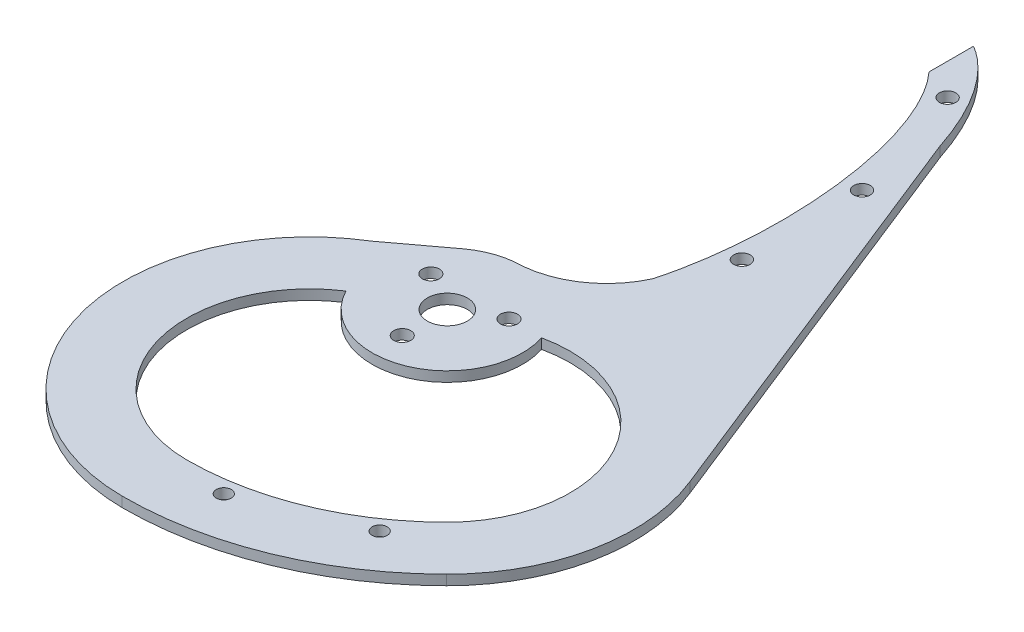
ISO-10303-21;
HEADER;
FILE_DESCRIPTION(('STEP AP214'),'2;1');
FILE_NAME('part.step','',(''),(''),'','','');
FILE_SCHEMA(('AUTOMOTIVE_DESIGN { 1 0 10303 214 1 1 1 1 }'));
ENDSEC;
DATA;
#1=APPLICATION_CONTEXT('core data for automotive mechanical design processes');
#2=APPLICATION_PROTOCOL_DEFINITION('international standard','automotive_design',2000,#1);
#3=PRODUCT_CONTEXT('',#1,'mechanical');
#4=PRODUCT('Part','Part','',(#3));
#5=PRODUCT_RELATED_PRODUCT_CATEGORY('part','',(#4));
#6=PRODUCT_DEFINITION_FORMATION('','',#4);
#7=PRODUCT_DEFINITION_CONTEXT('part definition',#1,'design');
#8=PRODUCT_DEFINITION('design','',#6,#7);
#9=PRODUCT_DEFINITION_SHAPE('','',#8);
#10=(LENGTH_UNIT() NAMED_UNIT(*) SI_UNIT(.MILLI.,.METRE.));
#11=(NAMED_UNIT(*) PLANE_ANGLE_UNIT() SI_UNIT($,.RADIAN.));
#12=(NAMED_UNIT(*) SI_UNIT($,.STERADIAN.) SOLID_ANGLE_UNIT());
#13=UNCERTAINTY_MEASURE_WITH_UNIT(LENGTH_MEASURE(1.E-05),#10,'distance_accuracy_value','');
#14=(GEOMETRIC_REPRESENTATION_CONTEXT(3) GLOBAL_UNCERTAINTY_ASSIGNED_CONTEXT((#13)) GLOBAL_UNIT_ASSIGNED_CONTEXT((#10,
#11,#12)) REPRESENTATION_CONTEXT('',''));
#15=CARTESIAN_POINT('',(0.,0.,0.));
#16=DIRECTION('',(0.,0.,1.));
#17=DIRECTION('',(1.,0.,0.));
#18=AXIS2_PLACEMENT_3D('',#15,#16,#17);
#19=CARTESIAN_POINT('',(0.,2.,-50.));
#20=DIRECTION('',(0.,1.,0.));
#21=DIRECTION('',(0.,0.,1.));
#22=AXIS2_PLACEMENT_3D('',#19,#20,#21);
#23=PLANE('',#22);
#24=CARTESIAN_POINT('',(13.298587158446,2.,-86.5375679284794));
#25=DIRECTION('',(0.,-1.,0.));
#26=DIRECTION('',(0.,0.,-1.));
#27=AXIS2_PLACEMENT_3D('',#24,#25,#26);
#28=CIRCLE('',#27,1.65);
#29=CARTESIAN_POINT('',(13.298587158446,2.,-88.1875679284794));
#30=VERTEX_POINT('',#29);
#31=EDGE_CURVE('E536',#30,#30,#28,.T.);
#32=ORIENTED_EDGE('',*,*,#31,.T.);
#33=EDGE_LOOP('',(#32));
#34=FACE_BOUND('',#33,.T.);
#35=CARTESIAN_POINT('',(20.7726012422299,2.,-61.9930669189694));
#36=DIRECTION('',(0.,-1.,0.));
#37=DIRECTION('',(0.,0.,-1.));
#38=AXIS2_PLACEMENT_3D('',#35,#36,#37);
#39=CIRCLE('',#38,1.64999999999971);
#40=CARTESIAN_POINT('',(20.7726012422299,2.,-63.6430669189691));
#41=VERTEX_POINT('',#40);
#42=EDGE_CURVE('E540',#41,#41,#39,.T.);
#43=ORIENTED_EDGE('',*,*,#42,.T.);
#44=EDGE_LOOP('',(#43));
#45=FACE_BOUND('',#44,.T.);
#46=CARTESIAN_POINT('',(20.7726012422298,2.,-38.0069330810301));
#47=DIRECTION('',(0.,-1.,0.));
#48=DIRECTION('',(0.,0.,-1.));
#49=AXIS2_PLACEMENT_3D('',#46,#47,#48);
#50=CIRCLE('',#49,1.65000000000007);
#51=CARTESIAN_POINT('',(20.7726012422298,2.,-39.6569330810302));
#52=VERTEX_POINT('',#51);
#53=EDGE_CURVE('E550',#52,#52,#50,.T.);
#54=ORIENTED_EDGE('',*,*,#53,.T.);
#55=EDGE_LOOP('',(#54));
#56=FACE_BOUND('',#55,.T.);
#57=CARTESIAN_POINT('',(-7.79422863405993,2.,-4.50000000000003));
#58=DIRECTION('',(0.,1.,0.));
#59=DIRECTION('',(0.,0.,1.));
#60=AXIS2_PLACEMENT_3D('',#57,#58,#59);
#61=CIRCLE('',#60,1.7);
#62=CARTESIAN_POINT('',(-7.79422863405993,2.,-2.80000000000003));
#63=VERTEX_POINT('',#62);
#64=EDGE_CURVE('E562',#63,#63,#61,.T.);
#65=ORIENTED_EDGE('',*,*,#64,.F.);
#66=EDGE_LOOP('',(#65));
#67=FACE_BOUND('',#66,.T.);
#68=CARTESIAN_POINT('',(0.,2.,0.));
#69=DIRECTION('',(0.,1.,0.));
#70=DIRECTION('',(0.,0.,1.));
#71=AXIS2_PLACEMENT_3D('',#68,#69,#70);
#72=CIRCLE('',#71,4.);
#73=CARTESIAN_POINT('',(0.,2.,4.));
#74=VERTEX_POINT('',#73);
#75=EDGE_CURVE('E167',#74,#74,#72,.T.);
#76=ORIENTED_EDGE('',*,*,#75,.F.);
#77=EDGE_LOOP('',(#76));
#78=FACE_BOUND('',#77,.T.);
#79=CARTESIAN_POINT('',(9.55064977168081,2.,54.1644264156715));
#80=DIRECTION('',(0.,1.,0.));
#81=DIRECTION('',(0.,0.,1.));
#82=AXIS2_PLACEMENT_3D('',#79,#80,#81);
#83=CIRCLE('',#82,1.5);
#84=CARTESIAN_POINT('',(9.55064977168081,2.,55.6644264156715));
#85=VERTEX_POINT('',#84);
#86=EDGE_CURVE('E183',#85,#85,#83,.T.);
#87=ORIENTED_EDGE('',*,*,#86,.F.);
#88=EDGE_LOOP('',(#87));
#89=FACE_BOUND('',#88,.T.);
#90=CARTESIAN_POINT('',(0.,2.,27.5));
#91=DIRECTION('',(0.,1.,0.));
#92=DIRECTION('',(0.,0.,1.));
#93=AXIS2_PLACEMENT_3D('',#90,#91,#92);
#94=CIRCLE('',#93,37.2013155746489);
#95=CARTESIAN_POINT('',(-19.3568297431625,2.,-4.26871138052086));
#96=VERTEX_POINT('',#95);
#97=CARTESIAN_POINT('',(-0.216613018645578,2.,64.7006849303177));
#98=VERTEX_POINT('',#97);
#99=EDGE_CURVE('E189',#96,#98,#94,.T.);
#100=ORIENTED_EDGE('',*,*,#99,.T.);
#101=CARTESIAN_POINT('',(0.,2.,0.));
#102=DIRECTION('',(0.,1.,0.));
#103=DIRECTION('',(0.,0.,-1.));
#104=AXIS2_PLACEMENT_3D('',#101,#102,#103);
#105=CIRCLE('',#104,64.7010475313351);
#106=CARTESIAN_POINT('',(45.6623974442698,2.,45.8385319495905));
#107=VERTEX_POINT('',#106);
#108=EDGE_CURVE('E192',#98,#107,#105,.T.);
#109=ORIENTED_EDGE('',*,*,#108,.T.);
#110=CARTESIAN_POINT('',(19.4454364826301,2.,19.44543648263));
#111=DIRECTION('',(0.,1.,0.));
#112=DIRECTION('',(0.,0.,1.));
#113=AXIS2_PLACEMENT_3D('',#110,#111,#112);
#114=CIRCLE('',#113,37.2011361438361);
#115=CARTESIAN_POINT('',(53.9585739590909,2.,5.56134947904393));
#116=VERTEX_POINT('',#115);
#117=EDGE_CURVE('E195',#107,#116,#114,.T.);
#118=ORIENTED_EDGE('',*,*,#117,.T.);
#119=DIRECTION('',(-0.370096027626198,0.,-0.928993503925247));
#120=VECTOR('',#119,1.);
#121=CARTESIAN_POINT('',(53.9585739590909,2.,5.56134947904394));
#122=LINE('',#121,#120);
#123=CARTESIAN_POINT('',(20.9296157641286,2.,-77.3460186473965));
#124=VERTEX_POINT('',#123);
#125=EDGE_CURVE('E197',#116,#124,#122,.T.);
#126=ORIENTED_EDGE('',*,*,#125,.T.);
#127=CARTESIAN_POINT('',(0.,2.,-50.));
#128=DIRECTION('',(0.,1.,0.));
#129=DIRECTION('',(0.,0.,-1.));
#130=AXIS2_PLACEMENT_3D('',#127,#128,#129);
#131=ELLIPSE('',#130,50.,25.);
#132=CARTESIAN_POINT('',(6.99999999999997,2.,-98.));
#133=VERTEX_POINT('',#132);
#134=EDGE_CURVE('E199',#124,#133,#131,.T.);
#135=ORIENTED_EDGE('',*,*,#134,.T.);
#136=DIRECTION('',(0.,0.,1.));
#137=VECTOR('',#136,1.);
#138=CARTESIAN_POINT('',(6.99999999999997,2.,-98.));
#139=LINE('',#138,#137);
#140=CARTESIAN_POINT('',(6.99999999999999,2.,-89.1252365482393));
#141=VERTEX_POINT('',#140);
#142=EDGE_CURVE('E202',#133,#141,#139,.T.);
#143=ORIENTED_EDGE('',*,*,#142,.T.);
#144=CARTESIAN_POINT('',(0.,2.,-50.));
#145=DIRECTION('',(0.,-1.,0.));
#146=DIRECTION('',(-0.0150123976327859,0.,-0.99988730760887));
#147=AXIS2_PLACEMENT_3D('',#144,#145,#146);
#148=ELLIPSE('',#147,43.022823817247,18.0020286916584);
#149=CARTESIAN_POINT('',(15.1926129793547,2.,-25.8295121690699));
#150=VERTEX_POINT('',#149);
#151=EDGE_CURVE('E255',#141,#150,#148,.T.);
#152=ORIENTED_EDGE('',*,*,#151,.T.);
#153=CARTESIAN_POINT('',(-1.78232615932989,2.,-33.5719448745214));
#154=DIRECTION('',(0.,-1.,0.));
#155=DIRECTION('',(0.,0.,1.));
#156=AXIS2_PLACEMENT_3D('',#153,#154,#155);
#157=CIRCLE('',#156,18.6572726560045);
#158=CARTESIAN_POINT('',(0.,2.,-15.));
#159=VERTEX_POINT('',#158);
#160=EDGE_CURVE('E258',#150,#159,#157,.T.);
#161=ORIENTED_EDGE('',*,*,#160,.T.);
#162=CARTESIAN_POINT('',(0.,2.,0.));
#163=DIRECTION('',(0.,1.,0.));
#164=DIRECTION('',(0.,0.,1.));
#165=AXIS2_PLACEMENT_3D('',#162,#163,#164);
#166=CIRCLE('',#165,15.);
#167=CARTESIAN_POINT('',(-8.97302418013445,2.,-12.0201845685797));
#168=VERTEX_POINT('',#167);
#169=EDGE_CURVE('E260',#159,#168,#166,.T.);
#170=ORIENTED_EDGE('',*,*,#169,.T.);
#171=DIRECTION('',(-0.801345637905316,0.,0.598201612008963));
#172=VECTOR('',#171,1.);
#173=CARTESIAN_POINT('',(-19.3568297431625,2.,-4.26871138052086));
#174=LINE('',#173,#172);
#175=EDGE_CURVE('E262',#168,#96,#174,.T.);
#176=ORIENTED_EDGE('',*,*,#175,.T.);
#177=EDGE_LOOP('',(#100,#109,#118,#126,#135,#143,#152,#161,#170,#176));
#178=FACE_BOUND('',#177,.T.);
#179=CARTESIAN_POINT('',(31.5467039993079,2.,45.0533624358943));
#180=DIRECTION('',(0.,1.,0.));
#181=DIRECTION('',(0.,0.,-1.));
#182=AXIS2_PLACEMENT_3D('',#179,#180,#181);
#183=CIRCLE('',#182,1.5);
#184=CARTESIAN_POINT('',(31.5467039993079,2.,43.5533624358943));
#185=VERTEX_POINT('',#184);
#186=EDGE_CURVE('E177',#185,#185,#183,.T.);
#187=ORIENTED_EDGE('',*,*,#186,.F.);
#188=EDGE_LOOP('',(#187));
#189=FACE_BOUND('',#188,.T.);
#190=CARTESIAN_POINT('',(0.,2.,0.));
#191=DIRECTION('',(0.,1.,0.));
#192=DIRECTION('',(0.,0.,1.));
#193=AXIS2_PLACEMENT_3D('',#190,#191,#192);
#194=CIRCLE('',#193,52.);
#195=CARTESIAN_POINT('',(0.,2.,52.));
#196=VERTEX_POINT('',#195);
#197=CARTESIAN_POINT('',(36.7695526217005,2.,36.7695526217005));
#198=VERTEX_POINT('',#197);
#199=EDGE_CURVE('E146',#196,#198,#194,.T.);
#200=ORIENTED_EDGE('',*,*,#199,.F.);
#201=CARTESIAN_POINT('',(0.,2.,27.5));
#202=DIRECTION('',(0.,1.,0.));
#203=DIRECTION('',(0.,0.,-1.));
#204=AXIS2_PLACEMENT_3D('',#201,#202,#203);
#205=CIRCLE('',#204,24.5);
#206=CARTESIAN_POINT('',(-13.3046192189774,2.,6.9272727272727));
#207=VERTEX_POINT('',#206);
#208=EDGE_CURVE('E138',#207,#196,#205,.T.);
#209=ORIENTED_EDGE('',*,*,#208,.F.);
#210=CARTESIAN_POINT('',(0.,2.,0.));
#211=DIRECTION('',(0.,-1.,0.));
#212=DIRECTION('',(0.,0.,1.));
#213=AXIS2_PLACEMENT_3D('',#210,#211,#212);
#214=CIRCLE('',#213,15.);
#215=CARTESIAN_POINT('',(14.306107991427,2.,-4.50946495026066));
#216=VERTEX_POINT('',#215);
#217=EDGE_CURVE('E161',#216,#207,#214,.T.);
#218=ORIENTED_EDGE('',*,*,#217,.F.);
#219=CARTESIAN_POINT('',(19.4454364826301,2.,19.44543648263));
#220=DIRECTION('',(0.,1.,0.));
#221=DIRECTION('',(0.,0.,1.));
#222=AXIS2_PLACEMENT_3D('',#219,#220,#221);
#223=CIRCLE('',#222,24.5);
#224=EDGE_CURVE('E159',#198,#216,#223,.T.);
#225=ORIENTED_EDGE('',*,*,#224,.F.);
#226=EDGE_LOOP('',(#200,#209,#218,#225));
#227=FACE_BOUND('',#226,.T.);
#228=CARTESIAN_POINT('',(0.,2.,9.));
#229=DIRECTION('',(0.,1.,0.));
#230=DIRECTION('',(0.,0.,1.));
#231=AXIS2_PLACEMENT_3D('',#228,#229,#230);
#232=CIRCLE('',#231,1.7);
#233=CARTESIAN_POINT('',(0.,2.,10.7));
#234=VERTEX_POINT('',#233);
#235=EDGE_CURVE('E568',#234,#234,#232,.T.);
#236=ORIENTED_EDGE('',*,*,#235,.F.);
#237=EDGE_LOOP('',(#236));
#238=FACE_BOUND('',#237,.T.);
#239=CARTESIAN_POINT('',(7.79422863405999,2.,-4.49999999999993));
#240=DIRECTION('',(0.,1.,0.));
#241=DIRECTION('',(0.,0.,1.));
#242=AXIS2_PLACEMENT_3D('',#239,#240,#241);
#243=CIRCLE('',#242,1.7);
#244=CARTESIAN_POINT('',(7.79422863405999,2.,-2.79999999999993));
#245=VERTEX_POINT('',#244);
#246=EDGE_CURVE('E556',#245,#245,#243,.T.);
#247=ORIENTED_EDGE('',*,*,#246,.F.);
#248=EDGE_LOOP('',(#247));
#249=FACE_BOUND('',#248,.T.);
#250=ADVANCED_FACE('F37',(#34,#45,#56,#67,#78,#89,#178,#189,#227,#238,#249),#23,.T.);
#251=CARTESIAN_POINT('',(0.,0.,-50.));
#252=DIRECTION('',(0.,1.,0.));
#253=DIRECTION('',(0.,0.,1.));
#254=AXIS2_PLACEMENT_3D('',#251,#252,#253);
#255=PLANE('',#254);
#256=CARTESIAN_POINT('',(13.298587158446,0.,-86.5375679284794));
#257=DIRECTION('',(0.,-1.,0.));
#258=DIRECTION('',(0.,0.,-1.));
#259=AXIS2_PLACEMENT_3D('',#256,#257,#258);
#260=CIRCLE('',#259,1.65);
#261=CARTESIAN_POINT('',(13.298587158446,0.,-88.1875679284794));
#262=VERTEX_POINT('',#261);
#263=EDGE_CURVE('E539',#262,#262,#260,.T.);
#264=ORIENTED_EDGE('',*,*,#263,.F.);
#265=EDGE_LOOP('',(#264));
#266=FACE_BOUND('',#265,.T.);
#267=CARTESIAN_POINT('',(20.7726012422299,0.,-61.9930669189694));
#268=DIRECTION('',(0.,-1.,0.));
#269=DIRECTION('',(0.,0.,-1.));
#270=AXIS2_PLACEMENT_3D('',#267,#268,#269);
#271=CIRCLE('',#270,1.64999999999971);
#272=CARTESIAN_POINT('',(20.7726012422299,0.,-63.6430669189691));
#273=VERTEX_POINT('',#272);
#274=EDGE_CURVE('E545',#273,#273,#271,.T.);
#275=ORIENTED_EDGE('',*,*,#274,.F.);
#276=EDGE_LOOP('',(#275));
#277=FACE_BOUND('',#276,.T.);
#278=CARTESIAN_POINT('',(20.7726012422298,0.,-38.0069330810301));
#279=DIRECTION('',(0.,-1.,0.));
#280=DIRECTION('',(0.,0.,-1.));
#281=AXIS2_PLACEMENT_3D('',#278,#279,#280);
#282=CIRCLE('',#281,1.65000000000007);
#283=CARTESIAN_POINT('',(20.7726012422298,0.,-39.6569330810302));
#284=VERTEX_POINT('',#283);
#285=EDGE_CURVE('E542',#284,#284,#282,.T.);
#286=ORIENTED_EDGE('',*,*,#285,.F.);
#287=EDGE_LOOP('',(#286));
#288=FACE_BOUND('',#287,.T.);
#289=CARTESIAN_POINT('',(31.5467039993079,0.,45.0533624358943));
#290=DIRECTION('',(0.,1.,0.));
#291=DIRECTION('',(0.,0.,-1.));
#292=AXIS2_PLACEMENT_3D('',#289,#290,#291);
#293=CIRCLE('',#292,1.5);
#294=CARTESIAN_POINT('',(31.5467039993079,0.,43.5533624358943));
#295=VERTEX_POINT('',#294);
#296=EDGE_CURVE('E154',#295,#295,#293,.T.);
#297=ORIENTED_EDGE('',*,*,#296,.T.);
#298=EDGE_LOOP('',(#297));
#299=FACE_BOUND('',#298,.T.);
#300=CARTESIAN_POINT('',(9.55064977168081,0.,54.1644264156715));
#301=DIRECTION('',(0.,1.,0.));
#302=DIRECTION('',(0.,0.,1.));
#303=AXIS2_PLACEMENT_3D('',#300,#301,#302);
#304=CIRCLE('',#303,1.5);
#305=CARTESIAN_POINT('',(9.55064977168081,0.,55.6644264156715));
#306=VERTEX_POINT('',#305);
#307=EDGE_CURVE('E180',#306,#306,#304,.T.);
#308=ORIENTED_EDGE('',*,*,#307,.T.);
#309=EDGE_LOOP('',(#308));
#310=FACE_BOUND('',#309,.T.);
#311=CARTESIAN_POINT('',(0.,0.,27.5));
#312=DIRECTION('',(0.,1.,0.));
#313=DIRECTION('',(0.,0.,1.));
#314=AXIS2_PLACEMENT_3D('',#311,#312,#313);
#315=CIRCLE('',#314,37.2013155746489);
#316=CARTESIAN_POINT('',(-19.3568297431625,0.,-4.26871138052086));
#317=VERTEX_POINT('',#316);
#318=CARTESIAN_POINT('',(-0.216613018645578,0.,64.7006849303177));
#319=VERTEX_POINT('',#318);
#320=EDGE_CURVE('E186',#317,#319,#315,.T.);
#321=ORIENTED_EDGE('',*,*,#320,.F.);
#322=DIRECTION('',(-0.801345637905316,0.,0.598201612008963));
#323=VECTOR('',#322,1.);
#324=CARTESIAN_POINT('',(-19.3568297431625,0.,-4.26871138052086));
#325=LINE('',#324,#323);
#326=CARTESIAN_POINT('',(-8.97302418013445,0.,-12.0201845685797));
#327=VERTEX_POINT('',#326);
#328=EDGE_CURVE('E193',#327,#317,#325,.T.);
#329=ORIENTED_EDGE('',*,*,#328,.F.);
#330=CARTESIAN_POINT('',(0.,0.,0.));
#331=DIRECTION('',(0.,1.,0.));
#332=DIRECTION('',(0.,0.,1.));
#333=AXIS2_PLACEMENT_3D('',#330,#331,#332);
#334=CIRCLE('',#333,15.);
#335=CARTESIAN_POINT('',(0.,0.,-15.));
#336=VERTEX_POINT('',#335);
#337=EDGE_CURVE('E281',#336,#327,#334,.T.);
#338=ORIENTED_EDGE('',*,*,#337,.F.);
#339=CARTESIAN_POINT('',(-1.78232615932989,0.,-33.5719448745214));
#340=DIRECTION('',(0.,-1.,0.));
#341=DIRECTION('',(0.,0.,1.));
#342=AXIS2_PLACEMENT_3D('',#339,#340,#341);
#343=CIRCLE('',#342,18.6572726560045);
#344=CARTESIAN_POINT('',(15.1926129793547,0.,-25.8295121690699));
#345=VERTEX_POINT('',#344);
#346=EDGE_CURVE('E279',#345,#336,#343,.T.);
#347=ORIENTED_EDGE('',*,*,#346,.F.);
#348=CARTESIAN_POINT('',(0.,0.,-50.));
#349=DIRECTION('',(0.,-1.,0.));
#350=DIRECTION('',(-0.0150123976327859,0.,-0.99988730760887));
#351=AXIS2_PLACEMENT_3D('',#348,#349,#350);
#352=ELLIPSE('',#351,43.022823817247,18.0020286916584);
#353=CARTESIAN_POINT('',(6.99999999999999,0.,-89.1252365482393));
#354=VERTEX_POINT('',#353);
#355=EDGE_CURVE('E277',#354,#345,#352,.T.);
#356=ORIENTED_EDGE('',*,*,#355,.F.);
#357=DIRECTION('',(0.,0.,1.));
#358=VECTOR('',#357,1.);
#359=CARTESIAN_POINT('',(6.99999999999997,0.,-98.));
#360=LINE('',#359,#358);
#361=CARTESIAN_POINT('',(6.99999999999997,0.,-98.));
#362=VERTEX_POINT('',#361);
#363=EDGE_CURVE('E275',#362,#354,#360,.T.);
#364=ORIENTED_EDGE('',*,*,#363,.F.);
#365=CARTESIAN_POINT('',(0.,0.,-50.));
#366=DIRECTION('',(0.,1.,0.));
#367=DIRECTION('',(0.,0.,-1.));
#368=AXIS2_PLACEMENT_3D('',#365,#366,#367);
#369=ELLIPSE('',#368,50.,25.);
#370=CARTESIAN_POINT('',(20.9296157641286,0.,-77.3460186473965));
#371=VERTEX_POINT('',#370);
#372=EDGE_CURVE('E273',#371,#362,#369,.T.);
#373=ORIENTED_EDGE('',*,*,#372,.F.);
#374=DIRECTION('',(-0.370096027626198,0.,-0.928993503925247));
#375=VECTOR('',#374,1.);
#376=CARTESIAN_POINT('',(53.9585739590909,0.,5.56134947904394));
#377=LINE('',#376,#375);
#378=CARTESIAN_POINT('',(53.9585739590909,0.,5.56134947904393));
#379=VERTEX_POINT('',#378);
#380=EDGE_CURVE('E271',#379,#371,#377,.T.);
#381=ORIENTED_EDGE('',*,*,#380,.F.);
#382=CARTESIAN_POINT('',(19.4454364826301,0.,19.44543648263));
#383=DIRECTION('',(0.,1.,0.));
#384=DIRECTION('',(0.,0.,1.));
#385=AXIS2_PLACEMENT_3D('',#382,#383,#384);
#386=CIRCLE('',#385,37.2011361438361);
#387=CARTESIAN_POINT('',(45.6623974442698,0.,45.8385319495905));
#388=VERTEX_POINT('',#387);
#389=EDGE_CURVE('E269',#388,#379,#386,.T.);
#390=ORIENTED_EDGE('',*,*,#389,.F.);
#391=CARTESIAN_POINT('',(0.,0.,0.));
#392=DIRECTION('',(0.,1.,0.));
#393=DIRECTION('',(0.,0.,-1.));
#394=AXIS2_PLACEMENT_3D('',#391,#392,#393);
#395=CIRCLE('',#394,64.7010475313351);
#396=EDGE_CURVE('E267',#319,#388,#395,.T.);
#397=ORIENTED_EDGE('',*,*,#396,.F.);
#398=EDGE_LOOP('',(#321,#329,#338,#347,#356,#364,#373,#381,#390,#397));
#399=FACE_BOUND('',#398,.T.);
#400=CARTESIAN_POINT('',(0.,0.,27.5));
#401=DIRECTION('',(0.,1.,0.));
#402=DIRECTION('',(0.,0.,-1.));
#403=AXIS2_PLACEMENT_3D('',#400,#401,#402);
#404=CIRCLE('',#403,24.5);
#405=CARTESIAN_POINT('',(-13.3046192189774,0.,6.9272727272727));
#406=VERTEX_POINT('',#405);
#407=CARTESIAN_POINT('',(0.,0.,52.));
#408=VERTEX_POINT('',#407);
#409=EDGE_CURVE('E60',#406,#408,#404,.T.);
#410=ORIENTED_EDGE('',*,*,#409,.T.);
#411=CARTESIAN_POINT('',(0.,0.,0.));
#412=DIRECTION('',(0.,1.,0.));
#413=DIRECTION('',(0.,0.,1.));
#414=AXIS2_PLACEMENT_3D('',#411,#412,#413);
#415=CIRCLE('',#414,52.);
#416=CARTESIAN_POINT('',(36.7695526217005,0.,36.7695526217005));
#417=VERTEX_POINT('',#416);
#418=EDGE_CURVE('E153',#408,#417,#415,.T.);
#419=ORIENTED_EDGE('',*,*,#418,.T.);
#420=CARTESIAN_POINT('',(19.4454364826301,0.,19.44543648263));
#421=DIRECTION('',(0.,1.,0.));
#422=DIRECTION('',(0.,0.,1.));
#423=AXIS2_PLACEMENT_3D('',#420,#421,#422);
#424=CIRCLE('',#423,24.5);
#425=CARTESIAN_POINT('',(14.306107991427,0.,-4.50946495026066));
#426=VERTEX_POINT('',#425);
#427=EDGE_CURVE('E169',#417,#426,#424,.T.);
#428=ORIENTED_EDGE('',*,*,#427,.T.);
#429=CARTESIAN_POINT('',(0.,0.,0.));
#430=DIRECTION('',(0.,-1.,0.));
#431=DIRECTION('',(0.,0.,1.));
#432=AXIS2_PLACEMENT_3D('',#429,#430,#431);
#433=CIRCLE('',#432,15.);
#434=EDGE_CURVE('E147',#426,#406,#433,.T.);
#435=ORIENTED_EDGE('',*,*,#434,.T.);
#436=EDGE_LOOP('',(#410,#419,#428,#435));
#437=FACE_BOUND('',#436,.T.);
#438=CARTESIAN_POINT('',(0.,0.,0.));
#439=DIRECTION('',(0.,1.,0.));
#440=DIRECTION('',(0.,0.,1.));
#441=AXIS2_PLACEMENT_3D('',#438,#439,#440);
#442=CIRCLE('',#441,4.);
#443=CARTESIAN_POINT('',(0.,0.,4.));
#444=VERTEX_POINT('',#443);
#445=EDGE_CURVE('E571',#444,#444,#442,.T.);
#446=ORIENTED_EDGE('',*,*,#445,.T.);
#447=EDGE_LOOP('',(#446));
#448=FACE_BOUND('',#447,.T.);
#449=CARTESIAN_POINT('',(0.,0.,9.));
#450=DIRECTION('',(0.,1.,0.));
#451=DIRECTION('',(0.,0.,1.));
#452=AXIS2_PLACEMENT_3D('',#449,#450,#451);
#453=CIRCLE('',#452,1.7);
#454=CARTESIAN_POINT('',(0.,0.,10.7));
#455=VERTEX_POINT('',#454);
#456=EDGE_CURVE('E565',#455,#455,#453,.T.);
#457=ORIENTED_EDGE('',*,*,#456,.T.);
#458=EDGE_LOOP('',(#457));
#459=FACE_BOUND('',#458,.T.);
#460=CARTESIAN_POINT('',(-7.79422863405993,0.,-4.50000000000003));
#461=DIRECTION('',(0.,1.,0.));
#462=DIRECTION('',(0.,0.,1.));
#463=AXIS2_PLACEMENT_3D('',#460,#461,#462);
#464=CIRCLE('',#463,1.7);
#465=CARTESIAN_POINT('',(-7.79422863405993,0.,-2.80000000000003));
#466=VERTEX_POINT('',#465);
#467=EDGE_CURVE('E559',#466,#466,#464,.T.);
#468=ORIENTED_EDGE('',*,*,#467,.T.);
#469=EDGE_LOOP('',(#468));
#470=FACE_BOUND('',#469,.T.);
#471=CARTESIAN_POINT('',(7.79422863405999,0.,-4.49999999999993));
#472=DIRECTION('',(0.,1.,0.));
#473=DIRECTION('',(0.,0.,1.));
#474=AXIS2_PLACEMENT_3D('',#471,#472,#473);
#475=CIRCLE('',#474,1.7);
#476=CARTESIAN_POINT('',(7.79422863405999,0.,-2.79999999999993));
#477=VERTEX_POINT('',#476);
#478=EDGE_CURVE('E553',#477,#477,#475,.T.);
#479=ORIENTED_EDGE('',*,*,#478,.T.);
#480=EDGE_LOOP('',(#479));
#481=FACE_BOUND('',#480,.T.);
#482=ADVANCED_FACE('F225',(#266,#277,#288,#299,#310,#399,#437,#448,#459,#470,#481),#255,.F.);
#483=CARTESIAN_POINT('',(0.,2.,27.5));
#484=DIRECTION('',(0.,-1.,0.));
#485=DIRECTION('',(0.,0.,-1.));
#486=AXIS2_PLACEMENT_3D('',#483,#484,#485);
#487=CYLINDRICAL_SURFACE('',#486,37.2013155746489);
#488=ORIENTED_EDGE('',*,*,#320,.T.);
#489=DIRECTION('',(0.,-1.,0.));
#490=VECTOR('',#489,1.);
#491=CARTESIAN_POINT('',(-0.216613018645578,2.,64.7006849303177));
#492=LINE('',#491,#490);
#493=EDGE_CURVE('E11',#98,#319,#492,.T.);
#494=ORIENTED_EDGE('',*,*,#493,.F.);
#495=ORIENTED_EDGE('',*,*,#99,.F.);
#496=DIRECTION('',(0.,-1.,0.));
#497=VECTOR('',#496,1.);
#498=CARTESIAN_POINT('',(-19.3568297431625,2.,-4.26871138052086));
#499=LINE('',#498,#497);
#500=EDGE_CURVE('E264',#96,#317,#499,.T.);
#501=ORIENTED_EDGE('',*,*,#500,.T.);
#502=EDGE_LOOP('',(#488,#494,#495,#501));
#503=FACE_BOUND('',#502,.T.);
#504=ADVANCED_FACE('F39',(#503),#487,.T.);
#505=CARTESIAN_POINT('',(0.,2.,0.));
#506=DIRECTION('',(0.,-1.,0.));
#507=DIRECTION('',(0.,0.,-1.));
#508=AXIS2_PLACEMENT_3D('',#505,#506,#507);
#509=CYLINDRICAL_SURFACE('',#508,64.7010475313351);
#510=ORIENTED_EDGE('',*,*,#396,.T.);
#511=DIRECTION('',(0.,-1.,0.));
#512=VECTOR('',#511,1.);
#513=CARTESIAN_POINT('',(45.6623974442698,2.,45.8385319495905));
#514=LINE('',#513,#512);
#515=EDGE_CURVE('E45',#107,#388,#514,.T.);
#516=ORIENTED_EDGE('',*,*,#515,.F.);
#517=ORIENTED_EDGE('',*,*,#108,.F.);
#518=ORIENTED_EDGE('',*,*,#493,.T.);
#519=EDGE_LOOP('',(#510,#516,#517,#518));
#520=FACE_BOUND('',#519,.T.);
#521=ADVANCED_FACE('F218',(#520),#509,.T.);
#522=CARTESIAN_POINT('',(19.4454364826301,2.,19.44543648263));
#523=DIRECTION('',(0.,-1.,0.));
#524=DIRECTION('',(0.,0.,-1.));
#525=AXIS2_PLACEMENT_3D('',#522,#523,#524);
#526=CYLINDRICAL_SURFACE('',#525,37.2011361438361);
#527=ORIENTED_EDGE('',*,*,#389,.T.);
#528=DIRECTION('',(0.,-1.,0.));
#529=VECTOR('',#528,1.);
#530=CARTESIAN_POINT('',(53.9585739590909,2.,5.56134947904393));
#531=LINE('',#530,#529);
#532=EDGE_CURVE('E304',#116,#379,#531,.T.);
#533=ORIENTED_EDGE('',*,*,#532,.F.);
#534=ORIENTED_EDGE('',*,*,#117,.F.);
#535=ORIENTED_EDGE('',*,*,#515,.T.);
#536=EDGE_LOOP('',(#527,#533,#534,#535));
#537=FACE_BOUND('',#536,.T.);
#538=ADVANCED_FACE('F215',(#537),#526,.T.);
#539=CARTESIAN_POINT('',(53.9585739590909,2.,5.56134947904394));
#540=DIRECTION('',(-0.928993503925247,0.,0.370096027626198));
#541=DIRECTION('',(0.370096027626198,0.,0.928993503925247));
#542=AXIS2_PLACEMENT_3D('',#539,#540,#541);
#543=PLANE('',#542);
#544=ORIENTED_EDGE('',*,*,#380,.T.);
#545=DIRECTION('',(0.,-1.,0.));
#546=VECTOR('',#545,1.);
#547=CARTESIAN_POINT('',(20.9296157641286,2.,-77.3460186473965));
#548=LINE('',#547,#546);
#549=EDGE_CURVE('E301',#124,#371,#548,.T.);
#550=ORIENTED_EDGE('',*,*,#549,.F.);
#551=ORIENTED_EDGE('',*,*,#125,.F.);
#552=ORIENTED_EDGE('',*,*,#532,.T.);
#553=EDGE_LOOP('',(#544,#550,#551,#552));
#554=FACE_BOUND('',#553,.T.);
#555=ADVANCED_FACE('F210',(#554),#543,.F.);
#556=DIRECTION('',(0.,-1.,0.));
#557=VECTOR('',#556,1.);
#558=SURFACE_OF_LINEAR_EXTRUSION('',#131,#557);
#559=ORIENTED_EDGE('',*,*,#372,.T.);
#560=DIRECTION('',(0.,-1.,0.));
#561=VECTOR('',#560,1.);
#562=CARTESIAN_POINT('',(6.99999999999997,2.,-98.));
#563=LINE('',#562,#561);
#564=EDGE_CURVE('E298',#133,#362,#563,.T.);
#565=ORIENTED_EDGE('',*,*,#564,.F.);
#566=ORIENTED_EDGE('',*,*,#134,.F.);
#567=ORIENTED_EDGE('',*,*,#549,.T.);
#568=EDGE_LOOP('',(#559,#565,#566,#567));
#569=FACE_BOUND('',#568,.T.);
#570=ADVANCED_FACE('F205',(#569),#558,.F.);
#571=CARTESIAN_POINT('',(6.99999999999997,2.,-98.));
#572=DIRECTION('',(1.,0.,0.));
#573=DIRECTION('',(0.,0.,-1.));
#574=AXIS2_PLACEMENT_3D('',#571,#572,#573);
#575=PLANE('',#574);
#576=ORIENTED_EDGE('',*,*,#363,.T.);
#577=DIRECTION('',(0.,-1.,0.));
#578=VECTOR('',#577,1.);
#579=CARTESIAN_POINT('',(6.99999999999999,2.,-89.1252365482393));
#580=LINE('',#579,#578);
#581=EDGE_CURVE('E295',#141,#354,#580,.T.);
#582=ORIENTED_EDGE('',*,*,#581,.F.);
#583=ORIENTED_EDGE('',*,*,#142,.F.);
#584=ORIENTED_EDGE('',*,*,#564,.T.);
#585=EDGE_LOOP('',(#576,#582,#583,#584));
#586=FACE_BOUND('',#585,.T.);
#587=ADVANCED_FACE('F209',(#586),#575,.F.);
#588=DIRECTION('',(0.,-1.,0.));
#589=VECTOR('',#588,1.);
#590=SURFACE_OF_LINEAR_EXTRUSION('',#148,#589);
#591=ORIENTED_EDGE('',*,*,#355,.T.);
#592=DIRECTION('',(0.,-1.,0.));
#593=VECTOR('',#592,1.);
#594=CARTESIAN_POINT('',(15.1926129793547,2.,-25.8295121690699));
#595=LINE('',#594,#593);
#596=EDGE_CURVE('E292',#150,#345,#595,.T.);
#597=ORIENTED_EDGE('',*,*,#596,.F.);
#598=ORIENTED_EDGE('',*,*,#151,.F.);
#599=ORIENTED_EDGE('',*,*,#581,.T.);
#600=EDGE_LOOP('',(#591,#597,#598,#599));
#601=FACE_BOUND('',#600,.T.);
#602=ADVANCED_FACE('F251',(#601),#590,.F.);
#603=CARTESIAN_POINT('',(-1.78232615932989,2.,-33.5719448745214));
#604=DIRECTION('',(0.,-1.,0.));
#605=DIRECTION('',(0.,0.,-1.));
#606=AXIS2_PLACEMENT_3D('',#603,#604,#605);
#607=CYLINDRICAL_SURFACE('',#606,18.6572726560045);
#608=ORIENTED_EDGE('',*,*,#346,.T.);
#609=DIRECTION('',(0.,-1.,0.));
#610=VECTOR('',#609,1.);
#611=CARTESIAN_POINT('',(0.,2.,-15.));
#612=LINE('',#611,#610);
#613=EDGE_CURVE('E289',#159,#336,#612,.T.);
#614=ORIENTED_EDGE('',*,*,#613,.F.);
#615=ORIENTED_EDGE('',*,*,#160,.F.);
#616=ORIENTED_EDGE('',*,*,#596,.T.);
#617=EDGE_LOOP('',(#608,#614,#615,#616));
#618=FACE_BOUND('',#617,.T.);
#619=ADVANCED_FACE('F248',(#618),#607,.F.);
#620=CARTESIAN_POINT('',(0.,2.,0.));
#621=DIRECTION('',(0.,-1.,0.));
#622=DIRECTION('',(0.,0.,-1.));
#623=AXIS2_PLACEMENT_3D('',#620,#621,#622);
#624=CYLINDRICAL_SURFACE('',#623,15.);
#625=ORIENTED_EDGE('',*,*,#337,.T.);
#626=DIRECTION('',(0.,-1.,0.));
#627=VECTOR('',#626,1.);
#628=CARTESIAN_POINT('',(-8.97302418013445,2.,-12.0201845685797));
#629=LINE('',#628,#627);
#630=EDGE_CURVE('E286',#168,#327,#629,.T.);
#631=ORIENTED_EDGE('',*,*,#630,.F.);
#632=ORIENTED_EDGE('',*,*,#169,.F.);
#633=ORIENTED_EDGE('',*,*,#613,.T.);
#634=EDGE_LOOP('',(#625,#631,#632,#633));
#635=FACE_BOUND('',#634,.T.);
#636=ADVANCED_FACE('F244',(#635),#624,.T.);
#637=CARTESIAN_POINT('',(-19.3568297431625,2.,-4.26871138052086));
#638=DIRECTION('',(0.598201612008963,0.,0.801345637905316));
#639=DIRECTION('',(0.801345637905316,0.,-0.598201612008963));
#640=AXIS2_PLACEMENT_3D('',#637,#638,#639);
#641=PLANE('',#640);
#642=ORIENTED_EDGE('',*,*,#328,.T.);
#643=ORIENTED_EDGE('',*,*,#500,.F.);
#644=ORIENTED_EDGE('',*,*,#175,.F.);
#645=ORIENTED_EDGE('',*,*,#630,.T.);
#646=EDGE_LOOP('',(#642,#643,#644,#645));
#647=FACE_BOUND('',#646,.T.);
#648=ADVANCED_FACE('F241',(#647),#641,.F.);
#649=CARTESIAN_POINT('',(9.55064977168081,2.,54.1644264156715));
#650=DIRECTION('',(0.,-1.,0.));
#651=DIRECTION('',(0.,0.,-1.));
#652=AXIS2_PLACEMENT_3D('',#649,#650,#651);
#653=CYLINDRICAL_SURFACE('',#652,1.5);
#654=ORIENTED_EDGE('',*,*,#86,.T.);
#655=EDGE_LOOP('',(#654));
#656=FACE_BOUND('',#655,.T.);
#657=ORIENTED_EDGE('',*,*,#307,.F.);
#658=EDGE_LOOP('',(#657));
#659=FACE_BOUND('',#658,.T.);
#660=ADVANCED_FACE('F238',(#656,#659),#653,.F.);
#661=CARTESIAN_POINT('',(31.5467039993079,2.,45.0533624358943));
#662=DIRECTION('',(0.,-1.,0.));
#663=DIRECTION('',(0.,0.,-1.));
#664=AXIS2_PLACEMENT_3D('',#661,#662,#663);
#665=CYLINDRICAL_SURFACE('',#664,1.5);
#666=ORIENTED_EDGE('',*,*,#186,.T.);
#667=EDGE_LOOP('',(#666));
#668=FACE_BOUND('',#667,.T.);
#669=ORIENTED_EDGE('',*,*,#296,.F.);
#670=EDGE_LOOP('',(#669));
#671=FACE_BOUND('',#670,.T.);
#672=ADVANCED_FACE('F367',(#668,#671),#665,.F.);
#673=CARTESIAN_POINT('',(0.,2.,27.5));
#674=DIRECTION('',(0.,-1.,0.));
#675=DIRECTION('',(0.,0.,-1.));
#676=AXIS2_PLACEMENT_3D('',#673,#674,#675);
#677=CYLINDRICAL_SURFACE('',#676,24.5);
#678=ORIENTED_EDGE('',*,*,#409,.F.);
#679=DIRECTION('',(0.,-1.,0.));
#680=VECTOR('',#679,1.);
#681=CARTESIAN_POINT('',(-13.3046192189774,2.,6.9272727272727));
#682=LINE('',#681,#680);
#683=EDGE_CURVE('E142',#207,#406,#682,.T.);
#684=ORIENTED_EDGE('',*,*,#683,.F.);
#685=ORIENTED_EDGE('',*,*,#208,.T.);
#686=DIRECTION('',(0.,-1.,0.));
#687=VECTOR('',#686,1.);
#688=CARTESIAN_POINT('',(0.,2.,52.));
#689=LINE('',#688,#687);
#690=EDGE_CURVE('E141',#196,#408,#689,.T.);
#691=ORIENTED_EDGE('',*,*,#690,.T.);
#692=EDGE_LOOP('',(#678,#684,#685,#691));
#693=FACE_BOUND('',#692,.T.);
#694=ADVANCED_FACE('F140',(#693),#677,.F.);
#695=CARTESIAN_POINT('',(0.,2.,0.));
#696=DIRECTION('',(0.,-1.,0.));
#697=DIRECTION('',(0.,0.,-1.));
#698=AXIS2_PLACEMENT_3D('',#695,#696,#697);
#699=CYLINDRICAL_SURFACE('',#698,52.);
#700=ORIENTED_EDGE('',*,*,#418,.F.);
#701=ORIENTED_EDGE('',*,*,#690,.F.);
#702=ORIENTED_EDGE('',*,*,#199,.T.);
#703=DIRECTION('',(0.,-1.,0.));
#704=VECTOR('',#703,1.);
#705=CARTESIAN_POINT('',(36.7695526217005,2.,36.7695526217005));
#706=LINE('',#705,#704);
#707=EDGE_CURVE('E155',#198,#417,#706,.T.);
#708=ORIENTED_EDGE('',*,*,#707,.T.);
#709=EDGE_LOOP('',(#700,#701,#702,#708));
#710=FACE_BOUND('',#709,.T.);
#711=ADVANCED_FACE('F150',(#710),#699,.F.);
#712=CARTESIAN_POINT('',(19.4454364826301,2.,19.44543648263));
#713=DIRECTION('',(0.,-1.,0.));
#714=DIRECTION('',(0.,0.,-1.));
#715=AXIS2_PLACEMENT_3D('',#712,#713,#714);
#716=CYLINDRICAL_SURFACE('',#715,24.5);
#717=ORIENTED_EDGE('',*,*,#427,.F.);
#718=ORIENTED_EDGE('',*,*,#707,.F.);
#719=ORIENTED_EDGE('',*,*,#224,.T.);
#720=DIRECTION('',(0.,-1.,0.));
#721=VECTOR('',#720,1.);
#722=CARTESIAN_POINT('',(14.306107991427,2.,-4.50946495026066));
#723=LINE('',#722,#721);
#724=EDGE_CURVE('E52',#216,#426,#723,.T.);
#725=ORIENTED_EDGE('',*,*,#724,.T.);
#726=EDGE_LOOP('',(#717,#718,#719,#725));
#727=FACE_BOUND('',#726,.T.);
#728=ADVANCED_FACE('F386',(#727),#716,.F.);
#729=CARTESIAN_POINT('',(0.,2.,0.));
#730=DIRECTION('',(0.,-1.,0.));
#731=DIRECTION('',(0.,0.,-1.));
#732=AXIS2_PLACEMENT_3D('',#729,#730,#731);
#733=CYLINDRICAL_SURFACE('',#732,15.);
#734=ORIENTED_EDGE('',*,*,#434,.F.);
#735=ORIENTED_EDGE('',*,*,#724,.F.);
#736=ORIENTED_EDGE('',*,*,#217,.T.);
#737=ORIENTED_EDGE('',*,*,#683,.T.);
#738=EDGE_LOOP('',(#734,#735,#736,#737));
#739=FACE_BOUND('',#738,.T.);
#740=ADVANCED_FACE('F393',(#739),#733,.T.);
#741=CARTESIAN_POINT('',(0.,2.,0.));
#742=DIRECTION('',(0.,-1.,0.));
#743=DIRECTION('',(0.,0.,-1.));
#744=AXIS2_PLACEMENT_3D('',#741,#742,#743);
#745=CYLINDRICAL_SURFACE('',#744,4.);
#746=ORIENTED_EDGE('',*,*,#75,.T.);
#747=EDGE_LOOP('',(#746));
#748=FACE_BOUND('',#747,.T.);
#749=ORIENTED_EDGE('',*,*,#445,.F.);
#750=EDGE_LOOP('',(#749));
#751=FACE_BOUND('',#750,.T.);
#752=ADVANCED_FACE('F401',(#748,#751),#745,.F.);
#753=CARTESIAN_POINT('',(0.,2.,9.));
#754=DIRECTION('',(0.,-1.,0.));
#755=DIRECTION('',(0.,0.,-1.));
#756=AXIS2_PLACEMENT_3D('',#753,#754,#755);
#757=CYLINDRICAL_SURFACE('',#756,1.7);
#758=ORIENTED_EDGE('',*,*,#235,.T.);
#759=EDGE_LOOP('',(#758));
#760=FACE_BOUND('',#759,.T.);
#761=ORIENTED_EDGE('',*,*,#456,.F.);
#762=EDGE_LOOP('',(#761));
#763=FACE_BOUND('',#762,.T.);
#764=ADVANCED_FACE('F408',(#760,#763),#757,.F.);
#765=CARTESIAN_POINT('',(-7.79422863405993,2.,-4.50000000000003));
#766=DIRECTION('',(0.,-1.,0.));
#767=DIRECTION('',(0.,0.,-1.));
#768=AXIS2_PLACEMENT_3D('',#765,#766,#767);
#769=CYLINDRICAL_SURFACE('',#768,1.7);
#770=ORIENTED_EDGE('',*,*,#64,.T.);
#771=EDGE_LOOP('',(#770));
#772=FACE_BOUND('',#771,.T.);
#773=ORIENTED_EDGE('',*,*,#467,.F.);
#774=EDGE_LOOP('',(#773));
#775=FACE_BOUND('',#774,.T.);
#776=ADVANCED_FACE('F416',(#772,#775),#769,.F.);
#777=CARTESIAN_POINT('',(7.79422863405999,2.,-4.49999999999993));
#778=DIRECTION('',(0.,-1.,0.));
#779=DIRECTION('',(0.,0.,-1.));
#780=AXIS2_PLACEMENT_3D('',#777,#778,#779);
#781=CYLINDRICAL_SURFACE('',#780,1.7);
#782=ORIENTED_EDGE('',*,*,#246,.T.);
#783=EDGE_LOOP('',(#782));
#784=FACE_BOUND('',#783,.T.);
#785=ORIENTED_EDGE('',*,*,#478,.F.);
#786=EDGE_LOOP('',(#785));
#787=FACE_BOUND('',#786,.T.);
#788=ADVANCED_FACE('F424',(#784,#787),#781,.F.);
#789=CARTESIAN_POINT('',(20.7726012422298,2.,-38.0069330810301));
#790=DIRECTION('',(0.,-1.,0.));
#791=DIRECTION('',(0.,0.,-1.));
#792=AXIS2_PLACEMENT_3D('',#789,#790,#791);
#793=CYLINDRICAL_SURFACE('',#792,1.65000000000007);
#794=ORIENTED_EDGE('',*,*,#53,.F.);
#795=EDGE_LOOP('',(#794));
#796=FACE_BOUND('',#795,.T.);
#797=ORIENTED_EDGE('',*,*,#285,.T.);
#798=EDGE_LOOP('',(#797));
#799=FACE_BOUND('',#798,.T.);
#800=ADVANCED_FACE('F432',(#796,#799),#793,.F.);
#801=CARTESIAN_POINT('',(20.7726012422299,2.,-61.9930669189694));
#802=DIRECTION('',(0.,-1.,0.));
#803=DIRECTION('',(0.,0.,-1.));
#804=AXIS2_PLACEMENT_3D('',#801,#802,#803);
#805=CYLINDRICAL_SURFACE('',#804,1.64999999999971);
#806=ORIENTED_EDGE('',*,*,#42,.F.);
#807=EDGE_LOOP('',(#806));
#808=FACE_BOUND('',#807,.T.);
#809=ORIENTED_EDGE('',*,*,#274,.T.);
#810=EDGE_LOOP('',(#809));
#811=FACE_BOUND('',#810,.T.);
#812=ADVANCED_FACE('F440',(#808,#811),#805,.F.);
#813=CARTESIAN_POINT('',(13.298587158446,2.,-86.5375679284794));
#814=DIRECTION('',(0.,-1.,0.));
#815=DIRECTION('',(0.,0.,-1.));
#816=AXIS2_PLACEMENT_3D('',#813,#814,#815);
#817=CYLINDRICAL_SURFACE('',#816,1.65);
#818=ORIENTED_EDGE('',*,*,#31,.F.);
#819=EDGE_LOOP('',(#818));
#820=FACE_BOUND('',#819,.T.);
#821=ORIENTED_EDGE('',*,*,#263,.T.);
#822=EDGE_LOOP('',(#821));
#823=FACE_BOUND('',#822,.T.);
#824=ADVANCED_FACE('F449',(#820,#823),#817,.F.);
#825=CLOSED_SHELL('',(#250,#482,#504,#521,#538,#555,#570,#587,#602,#619,#636,#648,#660,#672,
#694,#711,#728,#740,#752,#764,#776,#788,#800,#812,#824));
#826=MANIFOLD_SOLID_BREP('B2',#825);
#827=ADVANCED_BREP_SHAPE_REPRESENTATION('',(#18,#826),#14);
#828=SHAPE_DEFINITION_REPRESENTATION(#9,#827);
ENDSEC;
END-ISO-10303-21;
